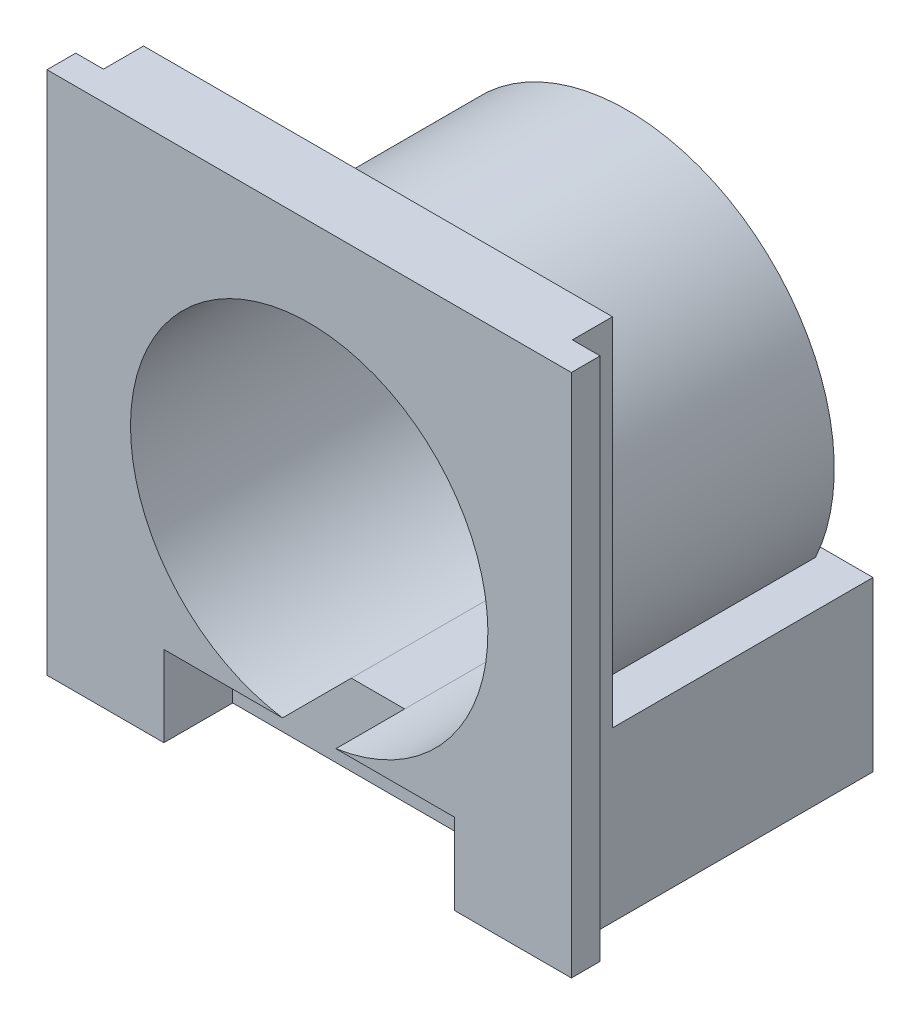
ISO-10303-21;
HEADER;
FILE_DESCRIPTION(('STEP AP214'),'2;1');
FILE_NAME('part.step','',(''),(''),'','','');
FILE_SCHEMA(('AUTOMOTIVE_DESIGN { 1 0 10303 214 1 1 1 1 }'));
ENDSEC;
DATA;
#1=APPLICATION_CONTEXT('core data for automotive mechanical design processes');
#2=APPLICATION_PROTOCOL_DEFINITION('international standard','automotive_design',2000,#1);
#3=PRODUCT_CONTEXT('',#1,'mechanical');
#4=PRODUCT('Part','Part','',(#3));
#5=PRODUCT_RELATED_PRODUCT_CATEGORY('part','',(#4));
#6=PRODUCT_DEFINITION_FORMATION('','',#4);
#7=PRODUCT_DEFINITION_CONTEXT('part definition',#1,'design');
#8=PRODUCT_DEFINITION('design','',#6,#7);
#9=PRODUCT_DEFINITION_SHAPE('','',#8);
#10=(LENGTH_UNIT() NAMED_UNIT(*) SI_UNIT(.MILLI.,.METRE.));
#11=(NAMED_UNIT(*) PLANE_ANGLE_UNIT() SI_UNIT($,.RADIAN.));
#12=(NAMED_UNIT(*) SI_UNIT($,.STERADIAN.) SOLID_ANGLE_UNIT());
#13=UNCERTAINTY_MEASURE_WITH_UNIT(LENGTH_MEASURE(1.E-05),#10,'distance_accuracy_value','');
#14=(GEOMETRIC_REPRESENTATION_CONTEXT(3) GLOBAL_UNCERTAINTY_ASSIGNED_CONTEXT((#13)) GLOBAL_UNIT_ASSIGNED_CONTEXT((#10,
#11,#12)) REPRESENTATION_CONTEXT('',''));
#15=CARTESIAN_POINT('',(0.,0.,0.));
#16=DIRECTION('',(0.,0.,1.));
#17=DIRECTION('',(1.,0.,0.));
#18=AXIS2_PLACEMENT_3D('',#15,#16,#17);
#19=CARTESIAN_POINT('',(0.,3.0734,0.));
#20=DIRECTION('',(0.,1.,0.));
#21=DIRECTION('',(0.,0.,1.));
#22=AXIS2_PLACEMENT_3D('',#19,#20,#21);
#23=PLANE('',#22);
#24=DIRECTION('',(-1.,0.,0.));
#25=VECTOR('',#24,1.);
#26=CARTESIAN_POINT('',(0.,3.0734,1.50495));
#27=LINE('',#26,#25);
#28=CARTESIAN_POINT('',(-4.86101491954198,3.0734,1.50495));
#29=VERTEX_POINT('',#28);
#30=CARTESIAN_POINT('',(-9.37078571428572,3.0734,1.50495));
#31=VERTEX_POINT('',#30);
#32=EDGE_CURVE('E261',#29,#31,#27,.T.);
#33=ORIENTED_EDGE('',*,*,#32,.F.);
#34=DIRECTION('',(0.,0.,1.));
#35=VECTOR('',#34,1.);
#36=CARTESIAN_POINT('',(-4.86101491954198,3.0734,-6.03885));
#37=LINE('',#36,#35);
#38=CARTESIAN_POINT('',(-4.86101491954198,3.0734,4.12115));
#39=VERTEX_POINT('',#38);
#40=EDGE_CURVE('E12',#29,#39,#37,.T.);
#41=ORIENTED_EDGE('',*,*,#40,.T.);
#42=DIRECTION('',(1.,0.,0.));
#43=VECTOR('',#42,1.);
#44=CARTESIAN_POINT('',(0.,3.0734,4.12115));
#45=LINE('',#44,#43);
#46=CARTESIAN_POINT('',(-9.37078571428572,3.0734,4.12115000000001));
#47=VERTEX_POINT('',#46);
#48=EDGE_CURVE('E254',#47,#39,#45,.T.);
#49=ORIENTED_EDGE('',*,*,#48,.F.);
#50=DIRECTION('',(0.,0.,-1.));
#51=VECTOR('',#50,1.);
#52=CARTESIAN_POINT('',(-9.37078571428572,3.0734,0.));
#53=LINE('',#52,#51);
#54=EDGE_CURVE('E248',#47,#31,#53,.T.);
#55=ORIENTED_EDGE('',*,*,#54,.T.);
#56=EDGE_LOOP('',(#33,#41,#49,#55));
#57=FACE_BOUND('',#56,.T.);
#58=ADVANCED_FACE('F77',(#57),#23,.F.);
#59=CARTESIAN_POINT('',(0.,6.4008,0.));
#60=DIRECTION('',(0.,1.,0.));
#61=DIRECTION('',(0.,0.,1.));
#62=AXIS2_PLACEMENT_3D('',#59,#60,#61);
#63=PLANE('',#62);
#64=DIRECTION('',(-1.,0.,0.));
#65=VECTOR('',#64,1.);
#66=CARTESIAN_POINT('',(0.,6.4008,1.50495));
#67=LINE('',#66,#65);
#68=CARTESIAN_POINT('',(-11.0061578109087,6.4008,1.50495));
#69=VERTEX_POINT('',#68);
#70=CARTESIAN_POINT('',(-12.7616857142857,6.4008,1.50495));
#71=VERTEX_POINT('',#70);
#72=EDGE_CURVE('E366',#69,#71,#67,.T.);
#73=ORIENTED_EDGE('',*,*,#72,.F.);
#74=DIRECTION('',(0.,0.,1.));
#75=VECTOR('',#74,1.);
#76=CARTESIAN_POINT('',(-11.0061578109087,6.4008,-7.96925));
#77=LINE('',#76,#75);
#78=CARTESIAN_POINT('',(-11.0061578109087,6.4008,-7.96925));
#79=VERTEX_POINT('',#78);
#80=EDGE_CURVE('E101',#69,#79,#77,.F.);
#81=ORIENTED_EDGE('',*,*,#80,.T.);
#82=DIRECTION('',(-1.,0.,0.));
#83=VECTOR('',#82,1.);
#84=CARTESIAN_POINT('',(0.,6.4008,-7.96925));
#85=LINE('',#84,#83);
#86=CARTESIAN_POINT('',(3.31358638233724,6.4008,-7.96925));
#87=VERTEX_POINT('',#86);
#88=EDGE_CURVE('E395',#87,#79,#85,.T.);
#89=ORIENTED_EDGE('',*,*,#88,.F.);
#90=DIRECTION('',(0.,0.,1.));
#91=VECTOR('',#90,1.);
#92=CARTESIAN_POINT('',(3.31358638233724,6.4008,-7.96925));
#93=LINE('',#92,#91);
#94=CARTESIAN_POINT('',(3.31358638233724,6.4008,1.50495));
#95=VERTEX_POINT('',#94);
#96=EDGE_CURVE('E239',#87,#95,#93,.T.);
#97=ORIENTED_EDGE('',*,*,#96,.T.);
#98=CARTESIAN_POINT('',(5.06911428571428,6.4008,1.50495));
#99=VERTEX_POINT('',#98);
#100=EDGE_CURVE('E361',#99,#95,#67,.T.);
#101=ORIENTED_EDGE('',*,*,#100,.F.);
#102=DIRECTION('',(0.,0.,1.));
#103=VECTOR('',#102,1.);
#104=CARTESIAN_POINT('',(5.06911428571428,6.4008,0.));
#105=LINE('',#104,#103);
#106=CARTESIAN_POINT('',(5.06911428571428,6.4008,-8.40105));
#107=VERTEX_POINT('',#106);
#108=EDGE_CURVE('E365',#107,#99,#105,.T.);
#109=ORIENTED_EDGE('',*,*,#108,.F.);
#110=DIRECTION('',(1.,0.,0.));
#111=VECTOR('',#110,1.);
#112=CARTESIAN_POINT('',(0.,6.4008,-8.40105));
#113=LINE('',#112,#111);
#114=CARTESIAN_POINT('',(-12.7616857142857,6.4008,-8.40105));
#115=VERTEX_POINT('',#114);
#116=EDGE_CURVE('E370',#115,#107,#113,.T.);
#117=ORIENTED_EDGE('',*,*,#116,.F.);
#118=DIRECTION('',(0.,0.,1.));
#119=VECTOR('',#118,1.);
#120=CARTESIAN_POINT('',(-12.7616857142857,6.4008,0.));
#121=LINE('',#120,#119);
#122=EDGE_CURVE('E374',#115,#71,#121,.T.);
#123=ORIENTED_EDGE('',*,*,#122,.T.);
#124=EDGE_LOOP('',(#73,#81,#89,#97,#101,#109,#117,#123));
#125=FACE_BOUND('',#124,.T.);
#126=ADVANCED_FACE('F473',(#125),#63,.T.);
#127=CARTESIAN_POINT('',(5.06911428571428,6.4008,0.));
#128=DIRECTION('',(1.,0.,0.));
#129=DIRECTION('',(0.,0.,-1.));
#130=AXIS2_PLACEMENT_3D('',#127,#128,#129);
#131=PLANE('',#130);
#132=DIRECTION('',(0.,0.,1.));
#133=VECTOR('',#132,1.);
#134=CARTESIAN_POINT('',(5.06911428571428,0.,0.));
#135=LINE('',#134,#133);
#136=CARTESIAN_POINT('',(5.06911428571428,0.,-8.40105));
#137=VERTEX_POINT('',#136);
#138=CARTESIAN_POINT('',(5.06911428571428,0.,3.02895));
#139=VERTEX_POINT('',#138);
#140=EDGE_CURVE('E379',#137,#139,#135,.T.);
#141=ORIENTED_EDGE('',*,*,#140,.F.);
#142=DIRECTION('',(0.,-1.,0.));
#143=VECTOR('',#142,1.);
#144=CARTESIAN_POINT('',(5.06911428571428,6.4008,-8.40105));
#145=LINE('',#144,#143);
#146=EDGE_CURVE('E392',#107,#137,#145,.T.);
#147=ORIENTED_EDGE('',*,*,#146,.F.);
#148=ORIENTED_EDGE('',*,*,#108,.T.);
#149=DIRECTION('',(0.,-1.,0.));
#150=VECTOR('',#149,1.);
#151=CARTESIAN_POINT('',(5.06911428571428,19.939,1.50495));
#152=LINE('',#151,#150);
#153=CARTESIAN_POINT('',(5.06911428571428,19.939,1.50495));
#154=VERTEX_POINT('',#153);
#155=EDGE_CURVE('E346',#154,#99,#152,.T.);
#156=ORIENTED_EDGE('',*,*,#155,.F.);
#157=DIRECTION('',(0.,0.,-1.));
#158=VECTOR('',#157,1.);
#159=CARTESIAN_POINT('',(5.06911428571428,19.939,3.02895));
#160=LINE('',#159,#158);
#161=CARTESIAN_POINT('',(5.06911428571428,19.939,3.02895));
#162=VERTEX_POINT('',#161);
#163=EDGE_CURVE('E339',#162,#154,#160,.T.);
#164=ORIENTED_EDGE('',*,*,#163,.F.);
#165=DIRECTION('',(0.,-1.,0.));
#166=VECTOR('',#165,1.);
#167=CARTESIAN_POINT('',(5.06911428571428,19.939,3.02895));
#168=LINE('',#167,#166);
#169=EDGE_CURVE('E353',#162,#139,#168,.T.);
#170=ORIENTED_EDGE('',*,*,#169,.T.);
#171=EDGE_LOOP('',(#141,#147,#148,#156,#164,#170));
#172=FACE_BOUND('',#171,.T.);
#173=ADVANCED_FACE('F453',(#172),#131,.T.);
#174=CARTESIAN_POINT('',(0.,6.4008,-8.40105));
#175=DIRECTION('',(0.,0.,-1.));
#176=DIRECTION('',(-1.,0.,0.));
#177=AXIS2_PLACEMENT_3D('',#174,#175,#176);
#178=PLANE('',#177);
#179=DIRECTION('',(1.,0.,0.));
#180=VECTOR('',#179,1.);
#181=CARTESIAN_POINT('',(0.,0.,-8.40105));
#182=LINE('',#181,#180);
#183=CARTESIAN_POINT('',(-12.7616857142857,0.,-8.40105));
#184=VERTEX_POINT('',#183);
#185=EDGE_CURVE('E382',#184,#137,#182,.T.);
#186=ORIENTED_EDGE('',*,*,#185,.F.);
#187=DIRECTION('',(0.,-1.,0.));
#188=VECTOR('',#187,1.);
#189=CARTESIAN_POINT('',(-12.7616857142857,6.4008,-8.40105));
#190=LINE('',#189,#188);
#191=EDGE_CURVE('E378',#115,#184,#190,.T.);
#192=ORIENTED_EDGE('',*,*,#191,.F.);
#193=ORIENTED_EDGE('',*,*,#116,.T.);
#194=ORIENTED_EDGE('',*,*,#146,.T.);
#195=EDGE_LOOP('',(#186,#192,#193,#194));
#196=FACE_BOUND('',#195,.T.);
#197=ADVANCED_FACE('F447',(#196),#178,.T.);
#198=CARTESIAN_POINT('',(-12.7616857142857,6.4008,0.));
#199=DIRECTION('',(1.,0.,0.));
#200=DIRECTION('',(0.,0.,-1.));
#201=AXIS2_PLACEMENT_3D('',#198,#199,#200);
#202=PLANE('',#201);
#203=DIRECTION('',(0.,0.,1.));
#204=VECTOR('',#203,1.);
#205=CARTESIAN_POINT('',(-12.7616857142857,0.,0.));
#206=LINE('',#205,#204);
#207=CARTESIAN_POINT('',(-12.7616857142857,0.,3.02895));
#208=VERTEX_POINT('',#207);
#209=EDGE_CURVE('E387',#184,#208,#206,.T.);
#210=ORIENTED_EDGE('',*,*,#209,.T.);
#211=DIRECTION('',(0.,-1.,0.));
#212=VECTOR('',#211,1.);
#213=CARTESIAN_POINT('',(-12.7616857142857,19.939,3.02895));
#214=LINE('',#213,#212);
#215=CARTESIAN_POINT('',(-12.7616857142857,19.939,3.02895));
#216=VERTEX_POINT('',#215);
#217=EDGE_CURVE('E335',#216,#208,#214,.T.);
#218=ORIENTED_EDGE('',*,*,#217,.F.);
#219=DIRECTION('',(0.,0.,-1.));
#220=VECTOR('',#219,1.);
#221=CARTESIAN_POINT('',(-12.7616857142857,19.939,3.02895));
#222=LINE('',#221,#220);
#223=CARTESIAN_POINT('',(-12.7616857142857,19.939,1.50495));
#224=VERTEX_POINT('',#223);
#225=EDGE_CURVE('E342',#216,#224,#222,.T.);
#226=ORIENTED_EDGE('',*,*,#225,.T.);
#227=DIRECTION('',(0.,-1.,0.));
#228=VECTOR('',#227,1.);
#229=CARTESIAN_POINT('',(-12.7616857142857,19.939,1.50495));
#230=LINE('',#229,#228);
#231=EDGE_CURVE('E313',#224,#71,#230,.T.);
#232=ORIENTED_EDGE('',*,*,#231,.T.);
#233=ORIENTED_EDGE('',*,*,#122,.F.);
#234=ORIENTED_EDGE('',*,*,#191,.T.);
#235=EDGE_LOOP('',(#210,#218,#226,#232,#233,#234));
#236=FACE_BOUND('',#235,.T.);
#237=ADVANCED_FACE('F467',(#236),#202,.F.);
#238=CARTESIAN_POINT('',(0.,0.,0.));
#239=DIRECTION('',(0.,1.,0.));
#240=DIRECTION('',(0.,0.,1.));
#241=AXIS2_PLACEMENT_3D('',#238,#239,#240);
#242=PLANE('',#241);
#243=DIRECTION('',(-1.,0.,0.));
#244=VECTOR('',#243,1.);
#245=CARTESIAN_POINT('',(0.,0.,1.50495));
#246=LINE('',#245,#244);
#247=CARTESIAN_POINT('',(1.67821428571429,0.,1.50495));
#248=VERTEX_POINT('',#247);
#249=CARTESIAN_POINT('',(-9.37078571428572,0.,1.50495));
#250=VERTEX_POINT('',#249);
#251=EDGE_CURVE('E253',#248,#250,#246,.T.);
#252=ORIENTED_EDGE('',*,*,#251,.T.);
#253=DIRECTION('',(0.,0.,-1.));
#254=VECTOR('',#253,1.);
#255=CARTESIAN_POINT('',(-9.37078571428572,0.,0.));
#256=LINE('',#255,#254);
#257=CARTESIAN_POINT('',(-9.37078571428572,0.,4.12115000000001));
#258=VERTEX_POINT('',#257);
#259=EDGE_CURVE('E247',#258,#250,#256,.T.);
#260=ORIENTED_EDGE('',*,*,#259,.F.);
#261=DIRECTION('',(1.,0.,0.));
#262=VECTOR('',#261,1.);
#263=CARTESIAN_POINT('',(-9.37078571428572,0.,4.12115));
#264=LINE('',#263,#262);
#265=CARTESIAN_POINT('',(-13.8157857142857,0.,4.12115));
#266=VERTEX_POINT('',#265);
#267=EDGE_CURVE('E383',#266,#258,#264,.T.);
#268=ORIENTED_EDGE('',*,*,#267,.F.);
#269=DIRECTION('',(0.,0.,1.));
#270=VECTOR('',#269,1.);
#271=CARTESIAN_POINT('',(-13.8157857142857,0.,0.));
#272=LINE('',#271,#270);
#273=CARTESIAN_POINT('',(-13.8157857142857,0.,3.02895));
#274=VERTEX_POINT('',#273);
#275=EDGE_CURVE('E308',#274,#266,#272,.T.);
#276=ORIENTED_EDGE('',*,*,#275,.F.);
#277=DIRECTION('',(1.,0.,0.));
#278=VECTOR('',#277,1.);
#279=CARTESIAN_POINT('',(0.,0.,3.02895));
#280=LINE('',#279,#278);
#281=EDGE_CURVE('E295',#274,#208,#280,.T.);
#282=ORIENTED_EDGE('',*,*,#281,.T.);
#283=ORIENTED_EDGE('',*,*,#209,.F.);
#284=ORIENTED_EDGE('',*,*,#185,.T.);
#285=ORIENTED_EDGE('',*,*,#140,.T.);
#286=CARTESIAN_POINT('',(6.12321428571429,0.,3.02895));
#287=VERTEX_POINT('',#286);
#288=EDGE_CURVE('E317',#139,#287,#280,.T.);
#289=ORIENTED_EDGE('',*,*,#288,.T.);
#290=DIRECTION('',(0.,0.,1.));
#291=VECTOR('',#290,1.);
#292=CARTESIAN_POINT('',(6.12321428571428,0.,0.));
#293=LINE('',#292,#291);
#294=CARTESIAN_POINT('',(6.12321428571429,0.,4.12115));
#295=VERTEX_POINT('',#294);
#296=EDGE_CURVE('E312',#287,#295,#293,.T.);
#297=ORIENTED_EDGE('',*,*,#296,.T.);
#298=CARTESIAN_POINT('',(1.67821428571429,0.,4.12115));
#299=VERTEX_POINT('',#298);
#300=EDGE_CURVE('E357',#299,#295,#264,.T.);
#301=ORIENTED_EDGE('',*,*,#300,.F.);
#302=DIRECTION('',(0.,0.,-1.));
#303=VECTOR('',#302,1.);
#304=CARTESIAN_POINT('',(1.67821428571429,0.,0.));
#305=LINE('',#304,#303);
#306=EDGE_CURVE('E270',#299,#248,#305,.T.);
#307=ORIENTED_EDGE('',*,*,#306,.T.);
#308=EDGE_LOOP('',(#252,#260,#268,#276,#282,#283,#284,#285,#289,#297,#301,#307));
#309=FACE_BOUND('',#308,.T.);
#310=ADVANCED_FACE('F418',(#309),#242,.F.);
#311=CARTESIAN_POINT('',(-9.37078571428572,6.4008,4.12115));
#312=DIRECTION('',(0.,0.,-1.));
#313=DIRECTION('',(-1.,0.,0.));
#314=AXIS2_PLACEMENT_3D('',#311,#312,#313);
#315=PLANE('',#314);
#316=ORIENTED_EDGE('',*,*,#48,.T.);
#317=CARTESIAN_POINT('',(-3.84628571428571,9.7917,4.12115));
#318=DIRECTION('',(0.,0.,1.));
#319=DIRECTION('',(1.,0.,0.));
#320=AXIS2_PLACEMENT_3D('',#317,#318,#319);
#321=CIRCLE('',#320,6.7945);
#322=CARTESIAN_POINT('',(-2.83155650902945,3.0734,4.12115));
#323=VERTEX_POINT('',#322);
#324=EDGE_CURVE('E224',#323,#39,#321,.T.);
#325=ORIENTED_EDGE('',*,*,#324,.F.);
#326=CARTESIAN_POINT('',(1.67821428571429,3.0734,4.12115));
#327=VERTEX_POINT('',#326);
#328=EDGE_CURVE('E252',#323,#327,#45,.T.);
#329=ORIENTED_EDGE('',*,*,#328,.T.);
#330=DIRECTION('',(0.,-1.,0.));
#331=VECTOR('',#330,1.);
#332=CARTESIAN_POINT('',(1.67821428571429,3.0734,4.12115));
#333=LINE('',#332,#331);
#334=EDGE_CURVE('E282',#327,#299,#333,.T.);
#335=ORIENTED_EDGE('',*,*,#334,.T.);
#336=ORIENTED_EDGE('',*,*,#300,.T.);
#337=DIRECTION('',(0.,-1.,0.));
#338=VECTOR('',#337,1.);
#339=CARTESIAN_POINT('',(6.12321428571429,19.939,4.12115));
#340=LINE('',#339,#338);
#341=CARTESIAN_POINT('',(6.12321428571429,19.939,4.12115));
#342=VERTEX_POINT('',#341);
#343=EDGE_CURVE('E327',#342,#295,#340,.T.);
#344=ORIENTED_EDGE('',*,*,#343,.F.);
#345=DIRECTION('',(1.,0.,0.));
#346=VECTOR('',#345,1.);
#347=CARTESIAN_POINT('',(0.,19.939,4.12115));
#348=LINE('',#347,#346);
#349=CARTESIAN_POINT('',(-13.8157857142857,19.939,4.12115));
#350=VERTEX_POINT('',#349);
#351=EDGE_CURVE('E294',#350,#342,#348,.T.);
#352=ORIENTED_EDGE('',*,*,#351,.F.);
#353=DIRECTION('',(0.,-1.,0.));
#354=VECTOR('',#353,1.);
#355=CARTESIAN_POINT('',(-13.8157857142857,19.939,4.12115));
#356=LINE('',#355,#354);
#357=EDGE_CURVE('E331',#350,#266,#356,.T.);
#358=ORIENTED_EDGE('',*,*,#357,.T.);
#359=ORIENTED_EDGE('',*,*,#267,.T.);
#360=DIRECTION('',(0.,-1.,0.));
#361=VECTOR('',#360,1.);
#362=CARTESIAN_POINT('',(-9.37078571428572,3.0734,4.12115000000001));
#363=LINE('',#362,#361);
#364=EDGE_CURVE('E286',#47,#258,#363,.T.);
#365=ORIENTED_EDGE('',*,*,#364,.F.);
#366=EDGE_LOOP('',(#316,#325,#329,#335,#336,#344,#352,#358,#359,#365));
#367=FACE_BOUND('',#366,.T.);
#368=ADVANCED_FACE('F79',(#367),#315,.F.);
#369=CARTESIAN_POINT('',(6.12321428571428,19.939,0.));
#370=DIRECTION('',(1.,0.,0.));
#371=DIRECTION('',(0.,0.,-1.));
#372=AXIS2_PLACEMENT_3D('',#369,#370,#371);
#373=PLANE('',#372);
#374=ORIENTED_EDGE('',*,*,#296,.F.);
#375=DIRECTION('',(0.,-1.,0.));
#376=VECTOR('',#375,1.);
#377=CARTESIAN_POINT('',(6.12321428571429,19.939,3.02895));
#378=LINE('',#377,#376);
#379=CARTESIAN_POINT('',(6.12321428571429,19.939,3.02895));
#380=VERTEX_POINT('',#379);
#381=EDGE_CURVE('E323',#380,#287,#378,.T.);
#382=ORIENTED_EDGE('',*,*,#381,.F.);
#383=DIRECTION('',(0.,0.,1.));
#384=VECTOR('',#383,1.);
#385=CARTESIAN_POINT('',(6.12321428571428,19.939,0.));
#386=LINE('',#385,#384);
#387=EDGE_CURVE('E298',#380,#342,#386,.T.);
#388=ORIENTED_EDGE('',*,*,#387,.T.);
#389=ORIENTED_EDGE('',*,*,#343,.T.);
#390=EDGE_LOOP('',(#374,#382,#388,#389));
#391=FACE_BOUND('',#390,.T.);
#392=ADVANCED_FACE('F462',(#391),#373,.T.);
#393=CARTESIAN_POINT('',(-13.8157857142857,19.939,0.));
#394=DIRECTION('',(1.,0.,0.));
#395=DIRECTION('',(0.,0.,-1.));
#396=AXIS2_PLACEMENT_3D('',#393,#394,#395);
#397=PLANE('',#396);
#398=ORIENTED_EDGE('',*,*,#275,.T.);
#399=ORIENTED_EDGE('',*,*,#357,.F.);
#400=DIRECTION('',(0.,0.,1.));
#401=VECTOR('',#400,1.);
#402=CARTESIAN_POINT('',(-13.8157857142857,19.939,0.));
#403=LINE('',#402,#401);
#404=CARTESIAN_POINT('',(-13.8157857142857,19.939,3.02895));
#405=VERTEX_POINT('',#404);
#406=EDGE_CURVE('E290',#405,#350,#403,.T.);
#407=ORIENTED_EDGE('',*,*,#406,.F.);
#408=DIRECTION('',(0.,-1.,0.));
#409=VECTOR('',#408,1.);
#410=CARTESIAN_POINT('',(-13.8157857142857,19.939,3.02895));
#411=LINE('',#410,#409);
#412=EDGE_CURVE('E307',#405,#274,#411,.T.);
#413=ORIENTED_EDGE('',*,*,#412,.T.);
#414=EDGE_LOOP('',(#398,#399,#407,#413));
#415=FACE_BOUND('',#414,.T.);
#416=ADVANCED_FACE('F439',(#415),#397,.F.);
#417=CARTESIAN_POINT('',(0.,19.939,0.));
#418=DIRECTION('',(0.,1.,0.));
#419=DIRECTION('',(0.,0.,1.));
#420=AXIS2_PLACEMENT_3D('',#417,#418,#419);
#421=PLANE('',#420);
#422=ORIENTED_EDGE('',*,*,#406,.T.);
#423=ORIENTED_EDGE('',*,*,#351,.T.);
#424=ORIENTED_EDGE('',*,*,#387,.F.);
#425=DIRECTION('',(1.,0.,0.));
#426=VECTOR('',#425,1.);
#427=CARTESIAN_POINT('',(0.,19.939,3.02895));
#428=LINE('',#427,#426);
#429=EDGE_CURVE('E302',#162,#380,#428,.T.);
#430=ORIENTED_EDGE('',*,*,#429,.F.);
#431=ORIENTED_EDGE('',*,*,#163,.T.);
#432=DIRECTION('',(1.,0.,0.));
#433=VECTOR('',#432,1.);
#434=CARTESIAN_POINT('',(-12.7616857142857,19.939,1.50495));
#435=LINE('',#434,#433);
#436=EDGE_CURVE('E289',#224,#154,#435,.T.);
#437=ORIENTED_EDGE('',*,*,#436,.F.);
#438=ORIENTED_EDGE('',*,*,#225,.F.);
#439=EDGE_CURVE('E303',#405,#216,#428,.T.);
#440=ORIENTED_EDGE('',*,*,#439,.F.);
#441=EDGE_LOOP('',(#422,#423,#424,#430,#431,#437,#438,#440));
#442=FACE_BOUND('',#441,.T.);
#443=ADVANCED_FACE('F464',(#442),#421,.T.);
#444=CARTESIAN_POINT('',(0.,19.939,3.02895));
#445=DIRECTION('',(0.,0.,-1.));
#446=DIRECTION('',(-1.,0.,0.));
#447=AXIS2_PLACEMENT_3D('',#444,#445,#446);
#448=PLANE('',#447);
#449=ORIENTED_EDGE('',*,*,#439,.T.);
#450=ORIENTED_EDGE('',*,*,#217,.T.);
#451=ORIENTED_EDGE('',*,*,#281,.F.);
#452=ORIENTED_EDGE('',*,*,#412,.F.);
#453=EDGE_LOOP('',(#449,#450,#451,#452));
#454=FACE_BOUND('',#453,.T.);
#455=ADVANCED_FACE('F442',(#454),#448,.T.);
#456=ORIENTED_EDGE('',*,*,#169,.F.);
#457=ORIENTED_EDGE('',*,*,#429,.T.);
#458=ORIENTED_EDGE('',*,*,#381,.T.);
#459=ORIENTED_EDGE('',*,*,#288,.F.);
#460=EDGE_LOOP('',(#456,#457,#458,#459));
#461=FACE_BOUND('',#460,.T.);
#462=ADVANCED_FACE('F458',(#461),#448,.T.);
#463=CARTESIAN_POINT('',(-12.7616857142857,19.939,1.50495));
#464=DIRECTION('',(0.,0.,-1.));
#465=DIRECTION('',(-1.,0.,0.));
#466=AXIS2_PLACEMENT_3D('',#463,#464,#465);
#467=PLANE('',#466);
#468=ORIENTED_EDGE('',*,*,#100,.T.);
#469=CARTESIAN_POINT('',(-3.84628571428571,9.6774,1.50495));
#470=DIRECTION('',(0.,0.,-1.));
#471=DIRECTION('',(-1.,0.,0.));
#472=AXIS2_PLACEMENT_3D('',#469,#470,#471);
#473=CIRCLE('',#472,7.874);
#474=EDGE_CURVE('E233',#69,#95,#473,.T.);
#475=ORIENTED_EDGE('',*,*,#474,.F.);
#476=ORIENTED_EDGE('',*,*,#72,.T.);
#477=ORIENTED_EDGE('',*,*,#231,.F.);
#478=ORIENTED_EDGE('',*,*,#436,.T.);
#479=ORIENTED_EDGE('',*,*,#155,.T.);
#480=EDGE_LOOP('',(#468,#475,#476,#477,#478,#479));
#481=FACE_BOUND('',#480,.T.);
#482=ADVANCED_FACE('F469',(#481),#467,.T.);
#483=CARTESIAN_POINT('',(-9.37078571428572,3.0734,0.));
#484=DIRECTION('',(-1.,0.,0.));
#485=DIRECTION('',(0.,0.,1.));
#486=AXIS2_PLACEMENT_3D('',#483,#484,#485);
#487=PLANE('',#486);
#488=ORIENTED_EDGE('',*,*,#259,.T.);
#489=DIRECTION('',(0.,-1.,0.));
#490=VECTOR('',#489,1.);
#491=CARTESIAN_POINT('',(-9.37078571428572,3.0734,1.50495));
#492=LINE('',#491,#490);
#493=EDGE_CURVE('E266',#31,#250,#492,.T.);
#494=ORIENTED_EDGE('',*,*,#493,.F.);
#495=ORIENTED_EDGE('',*,*,#54,.F.);
#496=ORIENTED_EDGE('',*,*,#364,.T.);
#497=EDGE_LOOP('',(#488,#494,#495,#496));
#498=FACE_BOUND('',#497,.T.);
#499=ADVANCED_FACE('F431',(#498),#487,.F.);
#500=CARTESIAN_POINT('',(1.67821428571429,3.0734,0.));
#501=DIRECTION('',(-1.,0.,0.));
#502=DIRECTION('',(0.,0.,1.));
#503=AXIS2_PLACEMENT_3D('',#500,#501,#502);
#504=PLANE('',#503);
#505=ORIENTED_EDGE('',*,*,#306,.F.);
#506=ORIENTED_EDGE('',*,*,#334,.F.);
#507=DIRECTION('',(0.,0.,-1.));
#508=VECTOR('',#507,1.);
#509=CARTESIAN_POINT('',(1.67821428571429,3.0734,0.));
#510=LINE('',#509,#508);
#511=CARTESIAN_POINT('',(1.67821428571429,3.0734,1.50495));
#512=VERTEX_POINT('',#511);
#513=EDGE_CURVE('E258',#327,#512,#510,.T.);
#514=ORIENTED_EDGE('',*,*,#513,.T.);
#515=DIRECTION('',(0.,-1.,0.));
#516=VECTOR('',#515,1.);
#517=CARTESIAN_POINT('',(1.67821428571429,3.0734,1.50495));
#518=LINE('',#517,#516);
#519=EDGE_CURVE('E279',#512,#248,#518,.T.);
#520=ORIENTED_EDGE('',*,*,#519,.T.);
#521=EDGE_LOOP('',(#505,#506,#514,#520));
#522=FACE_BOUND('',#521,.T.);
#523=ADVANCED_FACE('F412',(#522),#504,.T.);
#524=CARTESIAN_POINT('',(0.,3.0734,1.50495));
#525=DIRECTION('',(0.,0.,1.));
#526=DIRECTION('',(1.,0.,0.));
#527=AXIS2_PLACEMENT_3D('',#524,#525,#526);
#528=PLANE('',#527);
#529=CARTESIAN_POINT('',(-2.83155650902945,3.0734,1.50495));
#530=VERTEX_POINT('',#529);
#531=EDGE_CURVE('E262',#512,#530,#27,.T.);
#532=ORIENTED_EDGE('',*,*,#531,.T.);
#533=EDGE_CURVE('E215',#530,#29,#27,.T.);
#534=ORIENTED_EDGE('',*,*,#533,.T.);
#535=ORIENTED_EDGE('',*,*,#32,.T.);
#536=ORIENTED_EDGE('',*,*,#493,.T.);
#537=ORIENTED_EDGE('',*,*,#251,.F.);
#538=ORIENTED_EDGE('',*,*,#519,.F.);
#539=EDGE_LOOP('',(#532,#534,#535,#536,#537,#538));
#540=FACE_BOUND('',#539,.T.);
#541=ADVANCED_FACE('F409',(#540),#528,.T.);
#542=ORIENTED_EDGE('',*,*,#328,.F.);
#543=DIRECTION('',(0.,0.,1.));
#544=VECTOR('',#543,1.);
#545=CARTESIAN_POINT('',(-2.83155650902945,3.0734,-6.03885));
#546=LINE('',#545,#544);
#547=EDGE_CURVE('E86',#323,#530,#546,.F.);
#548=ORIENTED_EDGE('',*,*,#547,.T.);
#549=ORIENTED_EDGE('',*,*,#531,.F.);
#550=ORIENTED_EDGE('',*,*,#513,.F.);
#551=EDGE_LOOP('',(#542,#548,#549,#550));
#552=FACE_BOUND('',#551,.T.);
#553=ADVANCED_FACE('F404',(#552),#23,.F.);
#554=CARTESIAN_POINT('',(-3.84628571428572,9.6774,-7.96925));
#555=DIRECTION('',(0.,0.,1.));
#556=DIRECTION('',(1.,0.,0.));
#557=AXIS2_PLACEMENT_3D('',#554,#555,#556);
#558=CYLINDRICAL_SURFACE('',#557,7.874);
#559=ORIENTED_EDGE('',*,*,#80,.F.);
#560=ORIENTED_EDGE('',*,*,#474,.T.);
#561=ORIENTED_EDGE('',*,*,#96,.F.);
#562=CARTESIAN_POINT('',(-3.84628571428572,9.6774,-7.96925));
#563=DIRECTION('',(0.,0.,-1.));
#564=DIRECTION('',(-1.,0.,0.));
#565=AXIS2_PLACEMENT_3D('',#562,#563,#564);
#566=CIRCLE('',#565,7.874);
#567=EDGE_CURVE('E235',#79,#87,#566,.T.);
#568=ORIENTED_EDGE('',*,*,#567,.F.);
#569=EDGE_LOOP('',(#559,#560,#561,#568));
#570=FACE_BOUND('',#569,.T.);
#571=ADVANCED_FACE('F476',(#570),#558,.T.);
#572=CARTESIAN_POINT('',(-3.84628571428572,9.6774,-7.96925));
#573=DIRECTION('',(0.,0.,-1.));
#574=DIRECTION('',(-1.,0.,0.));
#575=AXIS2_PLACEMENT_3D('',#572,#573,#574);
#576=PLANE('',#575);
#577=ORIENTED_EDGE('',*,*,#567,.T.);
#578=ORIENTED_EDGE('',*,*,#88,.T.);
#579=EDGE_LOOP('',(#577,#578));
#580=FACE_BOUND('',#579,.T.);
#581=ADVANCED_FACE('F478',(#580),#576,.T.);
#582=CARTESIAN_POINT('',(0.,3.0734,-6.03885));
#583=DIRECTION('',(0.,-1.,0.));
#584=DIRECTION('',(0.,0.,-1.));
#585=AXIS2_PLACEMENT_3D('',#582,#583,#584);
#586=PLANE('',#585);
#587=ORIENTED_EDGE('',*,*,#533,.F.);
#588=DIRECTION('',(0.,0.,1.));
#589=VECTOR('',#588,1.);
#590=CARTESIAN_POINT('',(-2.83155650902945,3.0734,-6.03885));
#591=LINE('',#590,#589);
#592=CARTESIAN_POINT('',(-2.83155650902945,3.0734,-6.03885));
#593=VERTEX_POINT('',#592);
#594=EDGE_CURVE('E93',#593,#530,#591,.T.);
#595=ORIENTED_EDGE('',*,*,#594,.F.);
#596=DIRECTION('',(1.,0.,0.));
#597=VECTOR('',#596,1.);
#598=CARTESIAN_POINT('',(0.,3.0734,-6.03885));
#599=LINE('',#598,#597);
#600=CARTESIAN_POINT('',(-4.86101491954198,3.0734,-6.03885));
#601=VERTEX_POINT('',#600);
#602=EDGE_CURVE('E212',#601,#593,#599,.T.);
#603=ORIENTED_EDGE('',*,*,#602,.F.);
#604=DIRECTION('',(0.,0.,1.));
#605=VECTOR('',#604,1.);
#606=CARTESIAN_POINT('',(-4.86101491954198,3.0734,-6.03885));
#607=LINE('',#606,#605);
#608=EDGE_CURVE('E218',#601,#29,#607,.T.);
#609=ORIENTED_EDGE('',*,*,#608,.T.);
#610=EDGE_LOOP('',(#587,#595,#603,#609));
#611=FACE_BOUND('',#610,.T.);
#612=ADVANCED_FACE('F210',(#611),#586,.F.);
#613=CARTESIAN_POINT('',(-3.84628571428571,9.7917,-6.03885));
#614=DIRECTION('',(0.,0.,1.));
#615=DIRECTION('',(1.,0.,0.));
#616=AXIS2_PLACEMENT_3D('',#613,#614,#615);
#617=CYLINDRICAL_SURFACE('',#616,6.7945);
#618=ORIENTED_EDGE('',*,*,#324,.T.);
#619=ORIENTED_EDGE('',*,*,#40,.F.);
#620=ORIENTED_EDGE('',*,*,#608,.F.);
#621=CARTESIAN_POINT('',(-3.84628571428571,9.7917,-6.03885));
#622=DIRECTION('',(0.,0.,1.));
#623=DIRECTION('',(1.,0.,0.));
#624=AXIS2_PLACEMENT_3D('',#621,#622,#623);
#625=CIRCLE('',#624,6.7945);
#626=EDGE_CURVE('E219',#593,#601,#625,.T.);
#627=ORIENTED_EDGE('',*,*,#626,.F.);
#628=ORIENTED_EDGE('',*,*,#594,.T.);
#629=ORIENTED_EDGE('',*,*,#547,.F.);
#630=EDGE_LOOP('',(#618,#619,#620,#627,#628,#629));
#631=FACE_BOUND('',#630,.T.);
#632=ADVANCED_FACE('F226',(#631),#617,.F.);
#633=CARTESIAN_POINT('',(0.,0.,-6.03885));
#634=DIRECTION('',(0.,0.,1.));
#635=DIRECTION('',(1.,0.,0.));
#636=AXIS2_PLACEMENT_3D('',#633,#634,#635);
#637=PLANE('',#636);
#638=ORIENTED_EDGE('',*,*,#602,.T.);
#639=ORIENTED_EDGE('',*,*,#626,.T.);
#640=EDGE_LOOP('',(#638,#639));
#641=FACE_BOUND('',#640,.T.);
#642=ADVANCED_FACE('F222',(#641),#637,.T.);
#643=CLOSED_SHELL('',(#58,#126,#173,#197,#237,#310,#368,#392,#416,#443,#455,#462,#482,#499,#523,
#541,#553,#571,#581,#612,#632,#642));
#644=MANIFOLD_SOLID_BREP('B2',#643);
#645=ADVANCED_BREP_SHAPE_REPRESENTATION('',(#18,#644),#14);
#646=SHAPE_DEFINITION_REPRESENTATION(#9,#645);
ENDSEC;
END-ISO-10303-21;
